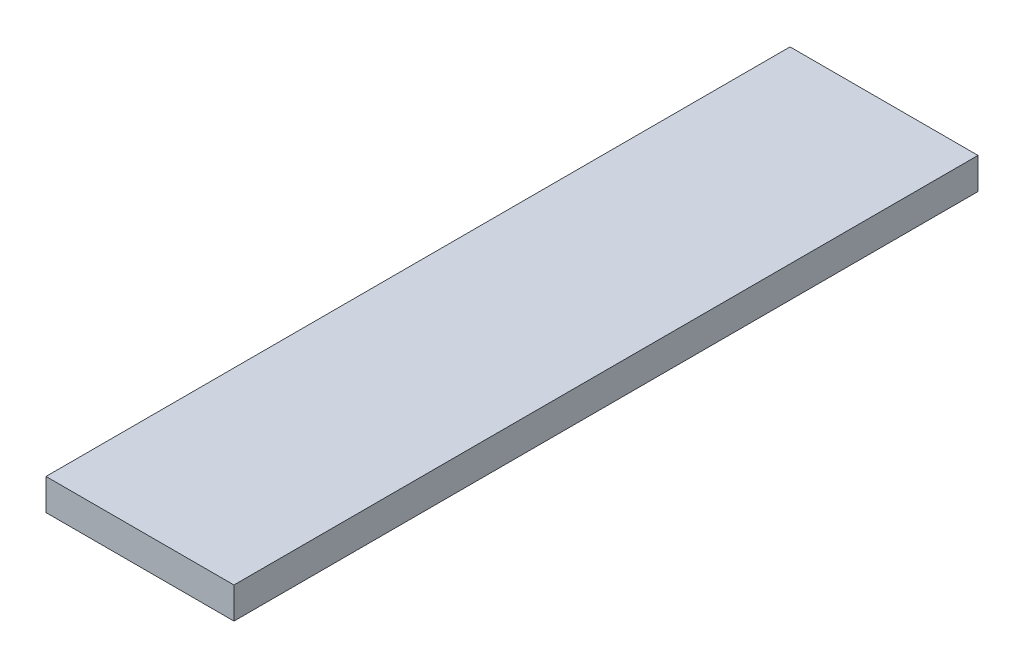
ISO-10303-21;
HEADER;
FILE_DESCRIPTION(('STEP AP214'),'2;1');
FILE_NAME('part.step','',(''),(''),'','','');
FILE_SCHEMA(('AUTOMOTIVE_DESIGN { 1 0 10303 214 1 1 1 1 }'));
ENDSEC;
DATA;
#1=APPLICATION_CONTEXT('core data for automotive mechanical design processes');
#2=APPLICATION_PROTOCOL_DEFINITION('international standard','automotive_design',2000,#1);
#3=PRODUCT_CONTEXT('',#1,'mechanical');
#4=PRODUCT('Part','Part','',(#3));
#5=PRODUCT_RELATED_PRODUCT_CATEGORY('part','',(#4));
#6=PRODUCT_DEFINITION_FORMATION('','',#4);
#7=PRODUCT_DEFINITION_CONTEXT('part definition',#1,'design');
#8=PRODUCT_DEFINITION('design','',#6,#7);
#9=PRODUCT_DEFINITION_SHAPE('','',#8);
#10=(LENGTH_UNIT() NAMED_UNIT(*) SI_UNIT(.MILLI.,.METRE.));
#11=(NAMED_UNIT(*) PLANE_ANGLE_UNIT() SI_UNIT($,.RADIAN.));
#12=(NAMED_UNIT(*) SI_UNIT($,.STERADIAN.) SOLID_ANGLE_UNIT());
#13=UNCERTAINTY_MEASURE_WITH_UNIT(LENGTH_MEASURE(1.E-05),#10,'distance_accuracy_value','');
#14=(GEOMETRIC_REPRESENTATION_CONTEXT(3) GLOBAL_UNCERTAINTY_ASSIGNED_CONTEXT((#13)) GLOBAL_UNIT_ASSIGNED_CONTEXT((#10,
#11,#12)) REPRESENTATION_CONTEXT('',''));
#15=CARTESIAN_POINT('',(0.,0.,0.));
#16=DIRECTION('',(0.,0.,1.));
#17=DIRECTION('',(1.,0.,0.));
#18=AXIS2_PLACEMENT_3D('',#15,#16,#17);
#19=CARTESIAN_POINT('',(-22.9548294010347,4.,-29.8409554140127));
#20=DIRECTION('',(1.,0.,0.));
#21=DIRECTION('',(0.,0.,-1.));
#22=AXIS2_PLACEMENT_3D('',#19,#20,#21);
#23=PLANE('',#22);
#24=DIRECTION('',(0.,0.,1.));
#25=VECTOR('',#24,1.);
#26=CARTESIAN_POINT('',(-22.9548294010347,0.,-29.8409554140127));
#27=LINE('',#26,#25);
#28=CARTESIAN_POINT('',(-22.9548294010347,0.,-29.8409554140127));
#29=VERTEX_POINT('',#28);
#30=CARTESIAN_POINT('',(-22.9548294010346,0.,65.1590445859873));
#31=VERTEX_POINT('',#30);
#32=EDGE_CURVE('E107',#29,#31,#27,.T.);
#33=ORIENTED_EDGE('',*,*,#32,.T.);
#34=DIRECTION('',(0.,-1.,0.));
#35=VECTOR('',#34,1.);
#36=CARTESIAN_POINT('',(-22.9548294010346,4.,65.1590445859873));
#37=LINE('',#36,#35);
#38=CARTESIAN_POINT('',(-22.9548294010346,4.,65.1590445859873));
#39=VERTEX_POINT('',#38);
#40=EDGE_CURVE('E11',#39,#31,#37,.T.);
#41=ORIENTED_EDGE('',*,*,#40,.F.);
#42=DIRECTION('',(0.,0.,1.));
#43=VECTOR('',#42,1.);
#44=CARTESIAN_POINT('',(-22.9548294010347,4.,-29.8409554140127));
#45=LINE('',#44,#43);
#46=CARTESIAN_POINT('',(-22.9548294010347,4.,-29.8409554140127));
#47=VERTEX_POINT('',#46);
#48=EDGE_CURVE('E91',#47,#39,#45,.T.);
#49=ORIENTED_EDGE('',*,*,#48,.F.);
#50=DIRECTION('',(0.,-1.,0.));
#51=VECTOR('',#50,1.);
#52=CARTESIAN_POINT('',(-22.9548294010347,4.,-29.8409554140127));
#53=LINE('',#52,#51);
#54=EDGE_CURVE('E103',#47,#29,#53,.T.);
#55=ORIENTED_EDGE('',*,*,#54,.T.);
#56=EDGE_LOOP('',(#33,#41,#49,#55));
#57=FACE_BOUND('',#56,.T.);
#58=ADVANCED_FACE('F39',(#57),#23,.F.);
#59=CARTESIAN_POINT('',(-22.9548294010346,4.,65.1590445859873));
#60=DIRECTION('',(0.,0.,-1.));
#61=DIRECTION('',(-1.,0.,0.));
#62=AXIS2_PLACEMENT_3D('',#59,#60,#61);
#63=PLANE('',#62);
#64=DIRECTION('',(1.,0.,0.));
#65=VECTOR('',#64,1.);
#66=CARTESIAN_POINT('',(-22.9548294010346,0.,65.1590445859873));
#67=LINE('',#66,#65);
#68=CARTESIAN_POINT('',(1.04517059896535,0.,65.1590445859873));
#69=VERTEX_POINT('',#68);
#70=EDGE_CURVE('E96',#31,#69,#67,.T.);
#71=ORIENTED_EDGE('',*,*,#70,.T.);
#72=DIRECTION('',(0.,-1.,0.));
#73=VECTOR('',#72,1.);
#74=CARTESIAN_POINT('',(1.04517059896535,4.,65.1590445859873));
#75=LINE('',#74,#73);
#76=CARTESIAN_POINT('',(1.04517059896535,4.,65.1590445859873));
#77=VERTEX_POINT('',#76);
#78=EDGE_CURVE('E48',#77,#69,#75,.T.);
#79=ORIENTED_EDGE('',*,*,#78,.F.);
#80=DIRECTION('',(1.,0.,0.));
#81=VECTOR('',#80,1.);
#82=CARTESIAN_POINT('',(-22.9548294010346,4.,65.1590445859873));
#83=LINE('',#82,#81);
#84=EDGE_CURVE('E86',#39,#77,#83,.T.);
#85=ORIENTED_EDGE('',*,*,#84,.F.);
#86=ORIENTED_EDGE('',*,*,#40,.T.);
#87=EDGE_LOOP('',(#71,#79,#85,#86));
#88=FACE_BOUND('',#87,.T.);
#89=ADVANCED_FACE('F95',(#88),#63,.F.);
#90=CARTESIAN_POINT('',(1.04517059896534,4.,-29.8409554140127));
#91=DIRECTION('',(-1.,0.,0.));
#92=DIRECTION('',(0.,0.,1.));
#93=AXIS2_PLACEMENT_3D('',#90,#91,#92);
#94=PLANE('',#93);
#95=DIRECTION('',(0.,0.,-1.));
#96=VECTOR('',#95,1.);
#97=CARTESIAN_POINT('',(1.04517059896534,0.,-29.8409554140127));
#98=LINE('',#97,#96);
#99=CARTESIAN_POINT('',(1.04517059896534,0.,-29.8409554140127));
#100=VERTEX_POINT('',#99);
#101=EDGE_CURVE('E73',#69,#100,#98,.T.);
#102=ORIENTED_EDGE('',*,*,#101,.T.);
#103=DIRECTION('',(0.,-1.,0.));
#104=VECTOR('',#103,1.);
#105=CARTESIAN_POINT('',(1.04517059896534,4.,-29.8409554140127));
#106=LINE('',#105,#104);
#107=CARTESIAN_POINT('',(1.04517059896534,4.,-29.8409554140127));
#108=VERTEX_POINT('',#107);
#109=EDGE_CURVE('E98',#108,#100,#106,.T.);
#110=ORIENTED_EDGE('',*,*,#109,.F.);
#111=DIRECTION('',(0.,0.,-1.));
#112=VECTOR('',#111,1.);
#113=CARTESIAN_POINT('',(1.04517059896534,4.,-29.8409554140127));
#114=LINE('',#113,#112);
#115=EDGE_CURVE('E89',#77,#108,#114,.T.);
#116=ORIENTED_EDGE('',*,*,#115,.F.);
#117=ORIENTED_EDGE('',*,*,#78,.T.);
#118=EDGE_LOOP('',(#102,#110,#116,#117));
#119=FACE_BOUND('',#118,.T.);
#120=ADVANCED_FACE('F99',(#119),#94,.F.);
#121=CARTESIAN_POINT('',(-22.9548294010347,4.,-29.8409554140127));
#122=DIRECTION('',(0.,0.,1.));
#123=DIRECTION('',(1.,0.,0.));
#124=AXIS2_PLACEMENT_3D('',#121,#122,#123);
#125=PLANE('',#124);
#126=DIRECTION('',(-1.,0.,0.));
#127=VECTOR('',#126,1.);
#128=CARTESIAN_POINT('',(-22.9548294010347,0.,-29.8409554140127));
#129=LINE('',#128,#127);
#130=EDGE_CURVE('E79',#100,#29,#129,.T.);
#131=ORIENTED_EDGE('',*,*,#130,.T.);
#132=ORIENTED_EDGE('',*,*,#54,.F.);
#133=DIRECTION('',(-1.,0.,0.));
#134=VECTOR('',#133,1.);
#135=CARTESIAN_POINT('',(-22.9548294010347,4.,-29.8409554140127));
#136=LINE('',#135,#134);
#137=EDGE_CURVE('E56',#108,#47,#136,.T.);
#138=ORIENTED_EDGE('',*,*,#137,.F.);
#139=ORIENTED_EDGE('',*,*,#109,.T.);
#140=EDGE_LOOP('',(#131,#132,#138,#139));
#141=FACE_BOUND('',#140,.T.);
#142=ADVANCED_FACE('F120',(#141),#125,.F.);
#143=CARTESIAN_POINT('',(0.,4.,0.));
#144=DIRECTION('',(0.,1.,0.));
#145=DIRECTION('',(0.,0.,1.));
#146=AXIS2_PLACEMENT_3D('',#143,#144,#145);
#147=PLANE('',#146);
#148=ORIENTED_EDGE('',*,*,#48,.T.);
#149=ORIENTED_EDGE('',*,*,#84,.T.);
#150=ORIENTED_EDGE('',*,*,#115,.T.);
#151=ORIENTED_EDGE('',*,*,#137,.T.);
#152=EDGE_LOOP('',(#148,#149,#150,#151));
#153=FACE_BOUND('',#152,.T.);
#154=ADVANCED_FACE('F87',(#153),#147,.T.);
#155=CARTESIAN_POINT('',(0.,0.,0.));
#156=DIRECTION('',(0.,1.,0.));
#157=DIRECTION('',(0.,0.,1.));
#158=AXIS2_PLACEMENT_3D('',#155,#156,#157);
#159=PLANE('',#158);
#160=ORIENTED_EDGE('',*,*,#32,.F.);
#161=ORIENTED_EDGE('',*,*,#130,.F.);
#162=ORIENTED_EDGE('',*,*,#101,.F.);
#163=ORIENTED_EDGE('',*,*,#70,.F.);
#164=EDGE_LOOP('',(#160,#161,#162,#163));
#165=FACE_BOUND('',#164,.T.);
#166=ADVANCED_FACE('F123',(#165),#159,.F.);
#167=CLOSED_SHELL('',(#58,#89,#120,#142,#154,#166));
#168=MANIFOLD_SOLID_BREP('B2',#167);
#169=ADVANCED_BREP_SHAPE_REPRESENTATION('',(#18,#168),#14);
#170=SHAPE_DEFINITION_REPRESENTATION(#9,#169);
ENDSEC;
END-ISO-10303-21;
